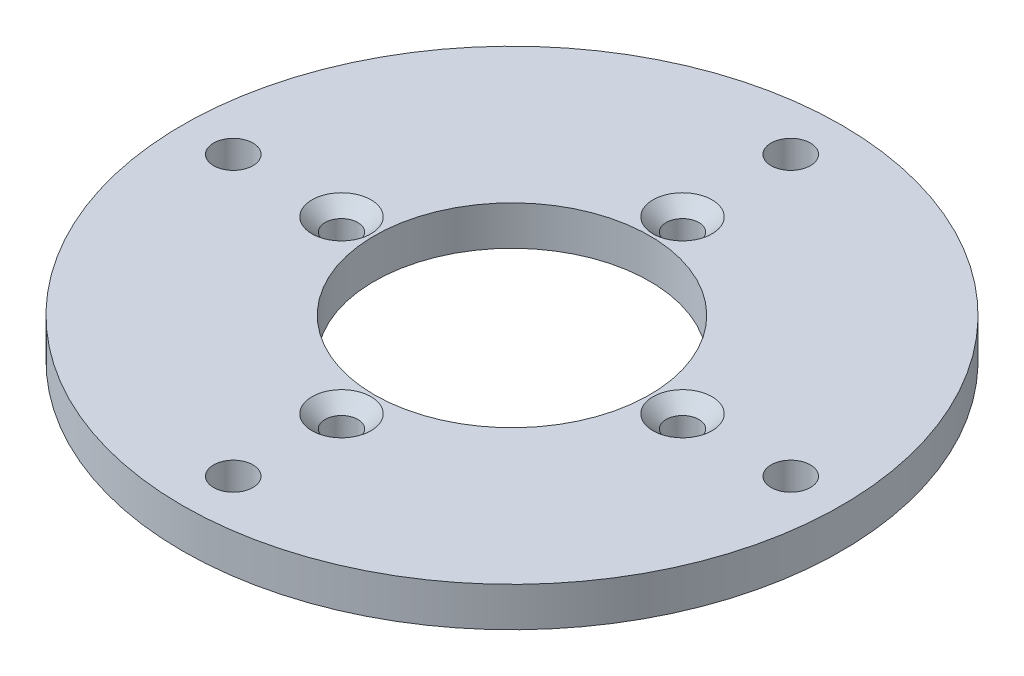
ISO-10303-21;
HEADER;
FILE_DESCRIPTION(('STEP AP214'),'2;1');
FILE_NAME('part.step','',(''),(''),'','','');
FILE_SCHEMA(('AUTOMOTIVE_DESIGN { 1 0 10303 214 1 1 1 1 }'));
ENDSEC;
DATA;
#1=APPLICATION_CONTEXT('core data for automotive mechanical design processes');
#2=APPLICATION_PROTOCOL_DEFINITION('international standard','automotive_design',2000,#1);
#3=PRODUCT_CONTEXT('',#1,'mechanical');
#4=PRODUCT('Part','Part','',(#3));
#5=PRODUCT_RELATED_PRODUCT_CATEGORY('part','',(#4));
#6=PRODUCT_DEFINITION_FORMATION('','',#4);
#7=PRODUCT_DEFINITION_CONTEXT('part definition',#1,'design');
#8=PRODUCT_DEFINITION('design','',#6,#7);
#9=PRODUCT_DEFINITION_SHAPE('','',#8);
#10=(LENGTH_UNIT() NAMED_UNIT(*) SI_UNIT(.MILLI.,.METRE.));
#11=(NAMED_UNIT(*) PLANE_ANGLE_UNIT() SI_UNIT($,.RADIAN.));
#12=(NAMED_UNIT(*) SI_UNIT($,.STERADIAN.) SOLID_ANGLE_UNIT());
#13=UNCERTAINTY_MEASURE_WITH_UNIT(LENGTH_MEASURE(1.E-05),#10,'distance_accuracy_value','');
#14=(GEOMETRIC_REPRESENTATION_CONTEXT(3) GLOBAL_UNCERTAINTY_ASSIGNED_CONTEXT((#13)) GLOBAL_UNIT_ASSIGNED_CONTEXT((#10,
#11,#12)) REPRESENTATION_CONTEXT('',''));
#15=CARTESIAN_POINT('',(0.,0.,0.));
#16=DIRECTION('',(0.,0.,1.));
#17=DIRECTION('',(1.,0.,0.));
#18=AXIS2_PLACEMENT_3D('',#15,#16,#17);
#19=CARTESIAN_POINT('',(0.,6.,0.));
#20=DIRECTION('',(0.,1.,0.));
#21=DIRECTION('',(0.,0.,1.));
#22=AXIS2_PLACEMENT_3D('',#19,#20,#21);
#23=PLANE('',#22);
#24=CARTESIAN_POINT('',(0.,6.,26.));
#25=DIRECTION('',(0.,1.,0.));
#26=DIRECTION('',(0.,0.,1.));
#27=AXIS2_PLACEMENT_3D('',#24,#25,#26);
#28=CIRCLE('',#27,4.5);
#29=CARTESIAN_POINT('',(0.,6.,30.5));
#30=VERTEX_POINT('',#29);
#31=EDGE_CURVE('E46',#30,#30,#28,.F.);
#32=ORIENTED_EDGE('',*,*,#31,.T.);
#33=EDGE_LOOP('',(#32));
#34=FACE_BOUND('',#33,.T.);
#35=CARTESIAN_POINT('',(26.,6.,0.));
#36=DIRECTION('',(0.,1.,0.));
#37=DIRECTION('',(0.,0.,1.));
#38=AXIS2_PLACEMENT_3D('',#35,#36,#37);
#39=CIRCLE('',#38,4.5);
#40=CARTESIAN_POINT('',(26.,6.,4.5));
#41=VERTEX_POINT('',#40);
#42=EDGE_CURVE('E51',#41,#41,#39,.F.);
#43=ORIENTED_EDGE('',*,*,#42,.T.);
#44=EDGE_LOOP('',(#43));
#45=FACE_BOUND('',#44,.T.);
#46=CARTESIAN_POINT('',(0.,6.,-26.));
#47=DIRECTION('',(0.,1.,0.));
#48=DIRECTION('',(0.,0.,1.));
#49=AXIS2_PLACEMENT_3D('',#46,#47,#48);
#50=CIRCLE('',#49,4.5);
#51=CARTESIAN_POINT('',(0.,6.,-21.5));
#52=VERTEX_POINT('',#51);
#53=EDGE_CURVE('E54',#52,#52,#50,.F.);
#54=ORIENTED_EDGE('',*,*,#53,.T.);
#55=EDGE_LOOP('',(#54));
#56=FACE_BOUND('',#55,.T.);
#57=CARTESIAN_POINT('',(-26.,6.,0.));
#58=DIRECTION('',(0.,1.,0.));
#59=DIRECTION('',(0.,0.,1.));
#60=AXIS2_PLACEMENT_3D('',#57,#58,#59);
#61=CIRCLE('',#60,4.5);
#62=CARTESIAN_POINT('',(-26.,6.,4.5));
#63=VERTEX_POINT('',#62);
#64=EDGE_CURVE('E57',#63,#63,#61,.F.);
#65=ORIENTED_EDGE('',*,*,#64,.T.);
#66=EDGE_LOOP('',(#65));
#67=FACE_BOUND('',#66,.T.);
#68=CARTESIAN_POINT('',(0.,6.,42.5));
#69=DIRECTION('',(0.,1.,0.));
#70=DIRECTION('',(0.,0.,1.));
#71=AXIS2_PLACEMENT_3D('',#68,#69,#70);
#72=CIRCLE('',#71,3.);
#73=CARTESIAN_POINT('',(0.,6.,45.5));
#74=VERTEX_POINT('',#73);
#75=EDGE_CURVE('E68',#74,#74,#72,.T.);
#76=ORIENTED_EDGE('',*,*,#75,.F.);
#77=EDGE_LOOP('',(#76));
#78=FACE_BOUND('',#77,.T.);
#79=CARTESIAN_POINT('',(42.5,6.,0.));
#80=DIRECTION('',(0.,1.,0.));
#81=DIRECTION('',(0.,0.,1.));
#82=AXIS2_PLACEMENT_3D('',#79,#80,#81);
#83=CIRCLE('',#82,3.);
#84=CARTESIAN_POINT('',(42.5,6.,3.));
#85=VERTEX_POINT('',#84);
#86=EDGE_CURVE('E67',#85,#85,#83,.T.);
#87=ORIENTED_EDGE('',*,*,#86,.F.);
#88=EDGE_LOOP('',(#87));
#89=FACE_BOUND('',#88,.T.);
#90=CARTESIAN_POINT('',(0.,6.,-42.5));
#91=DIRECTION('',(0.,1.,0.));
#92=DIRECTION('',(0.,0.,1.));
#93=AXIS2_PLACEMENT_3D('',#90,#91,#92);
#94=CIRCLE('',#93,3.);
#95=CARTESIAN_POINT('',(0.,6.,-39.5));
#96=VERTEX_POINT('',#95);
#97=EDGE_CURVE('E72',#96,#96,#94,.T.);
#98=ORIENTED_EDGE('',*,*,#97,.F.);
#99=EDGE_LOOP('',(#98));
#100=FACE_BOUND('',#99,.T.);
#101=CARTESIAN_POINT('',(-42.5,6.,0.));
#102=DIRECTION('',(0.,1.,0.));
#103=DIRECTION('',(0.,0.,1.));
#104=AXIS2_PLACEMENT_3D('',#101,#102,#103);
#105=CIRCLE('',#104,3.);
#106=CARTESIAN_POINT('',(-42.5,6.,3.));
#107=VERTEX_POINT('',#106);
#108=EDGE_CURVE('E76',#107,#107,#105,.T.);
#109=ORIENTED_EDGE('',*,*,#108,.F.);
#110=EDGE_LOOP('',(#109));
#111=FACE_BOUND('',#110,.T.);
#112=CARTESIAN_POINT('',(0.,6.,0.));
#113=DIRECTION('',(0.,1.,0.));
#114=DIRECTION('',(0.,0.,1.));
#115=AXIS2_PLACEMENT_3D('',#112,#113,#114);
#116=CIRCLE('',#115,50.25);
#117=CARTESIAN_POINT('',(0.,6.,50.25));
#118=VERTEX_POINT('',#117);
#119=EDGE_CURVE('E63',#118,#118,#116,.T.);
#120=ORIENTED_EDGE('',*,*,#119,.T.);
#121=EDGE_LOOP('',(#120));
#122=FACE_BOUND('',#121,.T.);
#123=CARTESIAN_POINT('',(0.,6.,0.));
#124=DIRECTION('',(0.,1.,0.));
#125=DIRECTION('',(0.,0.,1.));
#126=AXIS2_PLACEMENT_3D('',#123,#124,#125);
#127=CIRCLE('',#126,21.);
#128=CARTESIAN_POINT('',(0.,6.,21.));
#129=VERTEX_POINT('',#128);
#130=EDGE_CURVE('E84',#129,#129,#127,.T.);
#131=ORIENTED_EDGE('',*,*,#130,.F.);
#132=EDGE_LOOP('',(#131));
#133=FACE_BOUND('',#132,.T.);
#134=ADVANCED_FACE('F31',(#34,#45,#56,#67,#78,#89,#100,#111,#122,#133),#23,.T.);
#135=CARTESIAN_POINT('',(0.,0.,0.));
#136=DIRECTION('',(0.,1.,0.));
#137=DIRECTION('',(0.,0.,1.));
#138=AXIS2_PLACEMENT_3D('',#135,#136,#137);
#139=PLANE('',#138);
#140=CARTESIAN_POINT('',(0.,0.,42.5));
#141=DIRECTION('',(0.,1.,0.));
#142=DIRECTION('',(0.,0.,1.));
#143=AXIS2_PLACEMENT_3D('',#140,#141,#142);
#144=CIRCLE('',#143,3.);
#145=CARTESIAN_POINT('',(0.,0.,45.5));
#146=VERTEX_POINT('',#145);
#147=EDGE_CURVE('E64',#146,#146,#144,.T.);
#148=ORIENTED_EDGE('',*,*,#147,.T.);
#149=EDGE_LOOP('',(#148));
#150=FACE_BOUND('',#149,.T.);
#151=CARTESIAN_POINT('',(42.5,0.,0.));
#152=DIRECTION('',(0.,1.,0.));
#153=DIRECTION('',(0.,0.,1.));
#154=AXIS2_PLACEMENT_3D('',#151,#152,#153);
#155=CIRCLE('',#154,3.);
#156=CARTESIAN_POINT('',(42.5,0.,3.));
#157=VERTEX_POINT('',#156);
#158=EDGE_CURVE('E69',#157,#157,#155,.T.);
#159=ORIENTED_EDGE('',*,*,#158,.T.);
#160=EDGE_LOOP('',(#159));
#161=FACE_BOUND('',#160,.T.);
#162=CARTESIAN_POINT('',(0.,0.,-42.5));
#163=DIRECTION('',(0.,1.,0.));
#164=DIRECTION('',(0.,0.,1.));
#165=AXIS2_PLACEMENT_3D('',#162,#163,#164);
#166=CIRCLE('',#165,3.);
#167=CARTESIAN_POINT('',(0.,0.,-39.5));
#168=VERTEX_POINT('',#167);
#169=EDGE_CURVE('E73',#168,#168,#166,.T.);
#170=ORIENTED_EDGE('',*,*,#169,.T.);
#171=EDGE_LOOP('',(#170));
#172=FACE_BOUND('',#171,.T.);
#173=CARTESIAN_POINT('',(-42.5,0.,0.));
#174=DIRECTION('',(0.,1.,0.));
#175=DIRECTION('',(0.,0.,1.));
#176=AXIS2_PLACEMENT_3D('',#173,#174,#175);
#177=CIRCLE('',#176,3.);
#178=CARTESIAN_POINT('',(-42.5,0.,3.));
#179=VERTEX_POINT('',#178);
#180=EDGE_CURVE('E77',#179,#179,#177,.T.);
#181=ORIENTED_EDGE('',*,*,#180,.T.);
#182=EDGE_LOOP('',(#181));
#183=FACE_BOUND('',#182,.T.);
#184=CARTESIAN_POINT('',(0.,0.,26.));
#185=DIRECTION('',(0.,1.,0.));
#186=DIRECTION('',(0.,0.,1.));
#187=AXIS2_PLACEMENT_3D('',#184,#185,#186);
#188=CIRCLE('',#187,2.5);
#189=CARTESIAN_POINT('',(0.,0.,28.5));
#190=VERTEX_POINT('',#189);
#191=EDGE_CURVE('E80',#190,#190,#188,.T.);
#192=ORIENTED_EDGE('',*,*,#191,.T.);
#193=EDGE_LOOP('',(#192));
#194=FACE_BOUND('',#193,.T.);
#195=CARTESIAN_POINT('',(26.,0.,0.));
#196=DIRECTION('',(0.,1.,0.));
#197=DIRECTION('',(0.,0.,1.));
#198=AXIS2_PLACEMENT_3D('',#195,#196,#197);
#199=CIRCLE('',#198,2.5);
#200=CARTESIAN_POINT('',(26.,0.,2.5));
#201=VERTEX_POINT('',#200);
#202=EDGE_CURVE('E98',#201,#201,#199,.T.);
#203=ORIENTED_EDGE('',*,*,#202,.T.);
#204=EDGE_LOOP('',(#203));
#205=FACE_BOUND('',#204,.T.);
#206=CARTESIAN_POINT('',(-26.,0.,0.));
#207=DIRECTION('',(0.,1.,0.));
#208=DIRECTION('',(0.,0.,1.));
#209=AXIS2_PLACEMENT_3D('',#206,#207,#208);
#210=CIRCLE('',#209,2.5);
#211=CARTESIAN_POINT('',(-26.,0.,2.5));
#212=VERTEX_POINT('',#211);
#213=EDGE_CURVE('E95',#212,#212,#210,.T.);
#214=ORIENTED_EDGE('',*,*,#213,.T.);
#215=EDGE_LOOP('',(#214));
#216=FACE_BOUND('',#215,.T.);
#217=CARTESIAN_POINT('',(0.,0.,-26.));
#218=DIRECTION('',(0.,1.,0.));
#219=DIRECTION('',(0.,0.,1.));
#220=AXIS2_PLACEMENT_3D('',#217,#218,#219);
#221=CIRCLE('',#220,2.5);
#222=CARTESIAN_POINT('',(0.,0.,-23.5));
#223=VERTEX_POINT('',#222);
#224=EDGE_CURVE('E90',#223,#223,#221,.T.);
#225=ORIENTED_EDGE('',*,*,#224,.T.);
#226=EDGE_LOOP('',(#225));
#227=FACE_BOUND('',#226,.T.);
#228=CARTESIAN_POINT('',(0.,0.,0.));
#229=DIRECTION('',(0.,1.,0.));
#230=DIRECTION('',(0.,0.,1.));
#231=AXIS2_PLACEMENT_3D('',#228,#229,#230);
#232=CIRCLE('',#231,50.25);
#233=CARTESIAN_POINT('',(0.,0.,50.25));
#234=VERTEX_POINT('',#233);
#235=EDGE_CURVE('E81',#234,#234,#232,.T.);
#236=ORIENTED_EDGE('',*,*,#235,.F.);
#237=EDGE_LOOP('',(#236));
#238=FACE_BOUND('',#237,.T.);
#239=CARTESIAN_POINT('',(0.,0.,0.));
#240=DIRECTION('',(0.,1.,0.));
#241=DIRECTION('',(0.,0.,1.));
#242=AXIS2_PLACEMENT_3D('',#239,#240,#241);
#243=CIRCLE('',#242,21.);
#244=CARTESIAN_POINT('',(0.,0.,21.));
#245=VERTEX_POINT('',#244);
#246=EDGE_CURVE('E87',#245,#245,#243,.T.);
#247=ORIENTED_EDGE('',*,*,#246,.T.);
#248=EDGE_LOOP('',(#247));
#249=FACE_BOUND('',#248,.T.);
#250=ADVANCED_FACE('F117',(#150,#161,#172,#183,#194,#205,#216,#227,#238,#249),#139,.F.);
#251=CARTESIAN_POINT('',(0.,6.,0.));
#252=DIRECTION('',(0.,-1.,0.));
#253=DIRECTION('',(0.,0.,-1.));
#254=AXIS2_PLACEMENT_3D('',#251,#252,#253);
#255=CYLINDRICAL_SURFACE('',#254,50.25);
#256=ORIENTED_EDGE('',*,*,#119,.F.);
#257=EDGE_LOOP('',(#256));
#258=FACE_BOUND('',#257,.T.);
#259=ORIENTED_EDGE('',*,*,#235,.T.);
#260=EDGE_LOOP('',(#259));
#261=FACE_BOUND('',#260,.T.);
#262=ADVANCED_FACE('F134',(#258,#261),#255,.T.);
#263=CARTESIAN_POINT('',(0.,6.,0.));
#264=DIRECTION('',(0.,-1.,0.));
#265=DIRECTION('',(0.,0.,-1.));
#266=AXIS2_PLACEMENT_3D('',#263,#264,#265);
#267=CYLINDRICAL_SURFACE('',#266,21.);
#268=ORIENTED_EDGE('',*,*,#130,.T.);
#269=EDGE_LOOP('',(#268));
#270=FACE_BOUND('',#269,.T.);
#271=ORIENTED_EDGE('',*,*,#246,.F.);
#272=EDGE_LOOP('',(#271));
#273=FACE_BOUND('',#272,.T.);
#274=ADVANCED_FACE('F130',(#270,#273),#267,.F.);
#275=CARTESIAN_POINT('',(0.,0.,-26.));
#276=DIRECTION('',(0.,1.,0.));
#277=DIRECTION('',(0.,0.,1.));
#278=AXIS2_PLACEMENT_3D('',#275,#276,#277);
#279=CYLINDRICAL_SURFACE('',#278,2.5);
#280=CARTESIAN_POINT('',(0.,4.,-26.));
#281=DIRECTION('',(0.,1.,0.));
#282=DIRECTION('',(0.,0.,1.));
#283=AXIS2_PLACEMENT_3D('',#280,#281,#282);
#284=CIRCLE('',#283,2.5);
#285=CARTESIAN_POINT('',(0.,4.,-23.5));
#286=VERTEX_POINT('',#285);
#287=EDGE_CURVE('E38',#286,#286,#284,.T.);
#288=ORIENTED_EDGE('',*,*,#287,.T.);
#289=EDGE_LOOP('',(#288));
#290=FACE_BOUND('',#289,.T.);
#291=ORIENTED_EDGE('',*,*,#224,.F.);
#292=EDGE_LOOP('',(#291));
#293=FACE_BOUND('',#292,.T.);
#294=ADVANCED_FACE('F133',(#290,#293),#279,.F.);
#295=CARTESIAN_POINT('',(-26.,0.,0.));
#296=DIRECTION('',(0.,1.,0.));
#297=DIRECTION('',(0.,0.,1.));
#298=AXIS2_PLACEMENT_3D('',#295,#296,#297);
#299=CYLINDRICAL_SURFACE('',#298,2.5);
#300=CARTESIAN_POINT('',(-26.,4.,0.));
#301=DIRECTION('',(0.,1.,0.));
#302=DIRECTION('',(0.,0.,1.));
#303=AXIS2_PLACEMENT_3D('',#300,#301,#302);
#304=CIRCLE('',#303,2.5);
#305=CARTESIAN_POINT('',(-26.,4.,2.5));
#306=VERTEX_POINT('',#305);
#307=EDGE_CURVE('E10',#306,#306,#304,.T.);
#308=ORIENTED_EDGE('',*,*,#307,.T.);
#309=EDGE_LOOP('',(#308));
#310=FACE_BOUND('',#309,.T.);
#311=ORIENTED_EDGE('',*,*,#213,.F.);
#312=EDGE_LOOP('',(#311));
#313=FACE_BOUND('',#312,.T.);
#314=ADVANCED_FACE('F208',(#310,#313),#299,.F.);
#315=CARTESIAN_POINT('',(26.,0.,0.));
#316=DIRECTION('',(0.,1.,0.));
#317=DIRECTION('',(0.,0.,1.));
#318=AXIS2_PLACEMENT_3D('',#315,#316,#317);
#319=CYLINDRICAL_SURFACE('',#318,2.5);
#320=CARTESIAN_POINT('',(26.,4.,0.));
#321=DIRECTION('',(0.,1.,0.));
#322=DIRECTION('',(0.,0.,1.));
#323=AXIS2_PLACEMENT_3D('',#320,#321,#322);
#324=CIRCLE('',#323,2.5);
#325=CARTESIAN_POINT('',(26.,4.,2.5));
#326=VERTEX_POINT('',#325);
#327=EDGE_CURVE('E42',#326,#326,#324,.T.);
#328=ORIENTED_EDGE('',*,*,#327,.T.);
#329=EDGE_LOOP('',(#328));
#330=FACE_BOUND('',#329,.T.);
#331=ORIENTED_EDGE('',*,*,#202,.F.);
#332=EDGE_LOOP('',(#331));
#333=FACE_BOUND('',#332,.T.);
#334=ADVANCED_FACE('F199',(#330,#333),#319,.F.);
#335=CARTESIAN_POINT('',(0.,0.,26.));
#336=DIRECTION('',(0.,1.,0.));
#337=DIRECTION('',(0.,0.,1.));
#338=AXIS2_PLACEMENT_3D('',#335,#336,#337);
#339=CYLINDRICAL_SURFACE('',#338,2.5);
#340=CARTESIAN_POINT('',(0.,4.,26.));
#341=DIRECTION('',(0.,1.,0.));
#342=DIRECTION('',(0.,0.,1.));
#343=AXIS2_PLACEMENT_3D('',#340,#341,#342);
#344=CIRCLE('',#343,2.5);
#345=CARTESIAN_POINT('',(0.,4.,28.5));
#346=VERTEX_POINT('',#345);
#347=EDGE_CURVE('E60',#346,#346,#344,.T.);
#348=ORIENTED_EDGE('',*,*,#347,.T.);
#349=EDGE_LOOP('',(#348));
#350=FACE_BOUND('',#349,.T.);
#351=ORIENTED_EDGE('',*,*,#191,.F.);
#352=EDGE_LOOP('',(#351));
#353=FACE_BOUND('',#352,.T.);
#354=ADVANCED_FACE('F194',(#350,#353),#339,.F.);
#355=CARTESIAN_POINT('',(-42.5,-4.,0.));
#356=DIRECTION('',(0.,1.,0.));
#357=DIRECTION('',(0.,0.,1.));
#358=AXIS2_PLACEMENT_3D('',#355,#356,#357);
#359=CYLINDRICAL_SURFACE('',#358,3.);
#360=ORIENTED_EDGE('',*,*,#108,.T.);
#361=EDGE_LOOP('',(#360));
#362=FACE_BOUND('',#361,.T.);
#363=ORIENTED_EDGE('',*,*,#180,.F.);
#364=EDGE_LOOP('',(#363));
#365=FACE_BOUND('',#364,.T.);
#366=ADVANCED_FACE('F198',(#362,#365),#359,.F.);
#367=CARTESIAN_POINT('',(0.,-4.,-42.5));
#368=DIRECTION('',(0.,1.,0.));
#369=DIRECTION('',(0.,0.,1.));
#370=AXIS2_PLACEMENT_3D('',#367,#368,#369);
#371=CYLINDRICAL_SURFACE('',#370,3.);
#372=ORIENTED_EDGE('',*,*,#97,.T.);
#373=EDGE_LOOP('',(#372));
#374=FACE_BOUND('',#373,.T.);
#375=ORIENTED_EDGE('',*,*,#169,.F.);
#376=EDGE_LOOP('',(#375));
#377=FACE_BOUND('',#376,.T.);
#378=ADVANCED_FACE('F239',(#374,#377),#371,.F.);
#379=CARTESIAN_POINT('',(42.5,-4.,0.));
#380=DIRECTION('',(0.,1.,0.));
#381=DIRECTION('',(0.,0.,1.));
#382=AXIS2_PLACEMENT_3D('',#379,#380,#381);
#383=CYLINDRICAL_SURFACE('',#382,3.);
#384=ORIENTED_EDGE('',*,*,#86,.T.);
#385=EDGE_LOOP('',(#384));
#386=FACE_BOUND('',#385,.T.);
#387=ORIENTED_EDGE('',*,*,#158,.F.);
#388=EDGE_LOOP('',(#387));
#389=FACE_BOUND('',#388,.T.);
#390=ADVANCED_FACE('F230',(#386,#389),#383,.F.);
#391=CARTESIAN_POINT('',(0.,-4.,42.5));
#392=DIRECTION('',(0.,1.,0.));
#393=DIRECTION('',(0.,0.,1.));
#394=AXIS2_PLACEMENT_3D('',#391,#392,#393);
#395=CYLINDRICAL_SURFACE('',#394,3.);
#396=ORIENTED_EDGE('',*,*,#75,.T.);
#397=EDGE_LOOP('',(#396));
#398=FACE_BOUND('',#397,.T.);
#399=ORIENTED_EDGE('',*,*,#147,.F.);
#400=EDGE_LOOP('',(#399));
#401=FACE_BOUND('',#400,.T.);
#402=ADVANCED_FACE('F112',(#398,#401),#395,.F.);
#403=CARTESIAN_POINT('',(0.,4.,26.));
#404=DIRECTION('',(0.,1.,0.));
#405=DIRECTION('',(0.,0.,1.));
#406=AXIS2_PLACEMENT_3D('',#403,#404,#405);
#407=CONICAL_SURFACE('',#406,2.5,0.78539816339745);
#408=ORIENTED_EDGE('',*,*,#31,.F.);
#409=EDGE_LOOP('',(#408));
#410=FACE_BOUND('',#409,.T.);
#411=ORIENTED_EDGE('',*,*,#347,.F.);
#412=EDGE_LOOP('',(#411));
#413=FACE_BOUND('',#412,.T.);
#414=ADVANCED_FACE('F149',(#410,#413),#407,.F.);
#415=CARTESIAN_POINT('',(26.,4.,0.));
#416=DIRECTION('',(0.,1.,0.));
#417=DIRECTION('',(0.,0.,1.));
#418=AXIS2_PLACEMENT_3D('',#415,#416,#417);
#419=CONICAL_SURFACE('',#418,2.5,0.78539816339745);
#420=ORIENTED_EDGE('',*,*,#42,.F.);
#421=EDGE_LOOP('',(#420));
#422=FACE_BOUND('',#421,.T.);
#423=ORIENTED_EDGE('',*,*,#327,.F.);
#424=EDGE_LOOP('',(#423));
#425=FACE_BOUND('',#424,.T.);
#426=ADVANCED_FACE('F152',(#422,#425),#419,.F.);
#427=CARTESIAN_POINT('',(0.,4.,-26.));
#428=DIRECTION('',(0.,1.,0.));
#429=DIRECTION('',(0.,0.,1.));
#430=AXIS2_PLACEMENT_3D('',#427,#428,#429);
#431=CONICAL_SURFACE('',#430,2.5,0.78539816339745);
#432=ORIENTED_EDGE('',*,*,#53,.F.);
#433=EDGE_LOOP('',(#432));
#434=FACE_BOUND('',#433,.T.);
#435=ORIENTED_EDGE('',*,*,#287,.F.);
#436=EDGE_LOOP('',(#435));
#437=FACE_BOUND('',#436,.T.);
#438=ADVANCED_FACE('F155',(#434,#437),#431,.F.);
#439=CARTESIAN_POINT('',(-26.,4.,0.));
#440=DIRECTION('',(0.,1.,0.));
#441=DIRECTION('',(0.,0.,1.));
#442=AXIS2_PLACEMENT_3D('',#439,#440,#441);
#443=CONICAL_SURFACE('',#442,2.5,0.78539816339745);
#444=ORIENTED_EDGE('',*,*,#64,.F.);
#445=EDGE_LOOP('',(#444));
#446=FACE_BOUND('',#445,.T.);
#447=ORIENTED_EDGE('',*,*,#307,.F.);
#448=EDGE_LOOP('',(#447));
#449=FACE_BOUND('',#448,.T.);
#450=ADVANCED_FACE('F33',(#446,#449),#443,.F.);
#451=CLOSED_SHELL('',(#134,#250,#262,#274,#294,#314,#334,#354,#366,#378,#390,#402,#414,#426,
#438,#450));
#452=MANIFOLD_SOLID_BREP('B2',#451);
#453=ADVANCED_BREP_SHAPE_REPRESENTATION('',(#18,#452),#14);
#454=SHAPE_DEFINITION_REPRESENTATION(#9,#453);
ENDSEC;
END-ISO-10303-21;
